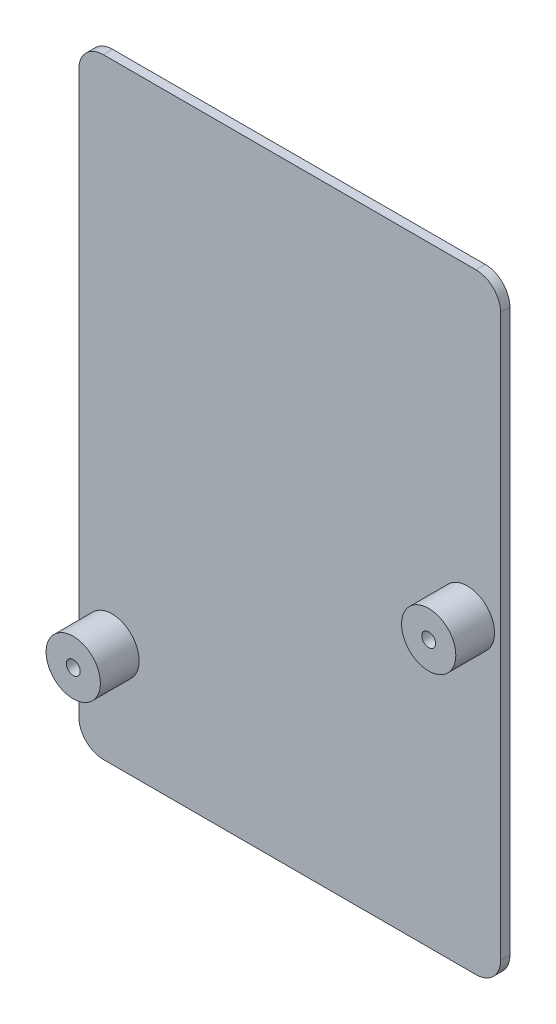
ISO-10303-21;
HEADER;
FILE_DESCRIPTION(('STEP AP214'),'2;1');
FILE_NAME('part.step','',(''),(''),'','','');
FILE_SCHEMA(('AUTOMOTIVE_DESIGN { 1 0 10303 214 1 1 1 1 }'));
ENDSEC;
DATA;
#1=APPLICATION_CONTEXT('core data for automotive mechanical design processes');
#2=APPLICATION_PROTOCOL_DEFINITION('international standard','automotive_design',2000,#1);
#3=PRODUCT_CONTEXT('',#1,'mechanical');
#4=PRODUCT('Part','Part','',(#3));
#5=PRODUCT_RELATED_PRODUCT_CATEGORY('part','',(#4));
#6=PRODUCT_DEFINITION_FORMATION('','',#4);
#7=PRODUCT_DEFINITION_CONTEXT('part definition',#1,'design');
#8=PRODUCT_DEFINITION('design','',#6,#7);
#9=PRODUCT_DEFINITION_SHAPE('','',#8);
#10=(LENGTH_UNIT() NAMED_UNIT(*) SI_UNIT(.MILLI.,.METRE.));
#11=(NAMED_UNIT(*) PLANE_ANGLE_UNIT() SI_UNIT($,.RADIAN.));
#12=(NAMED_UNIT(*) SI_UNIT($,.STERADIAN.) SOLID_ANGLE_UNIT());
#13=UNCERTAINTY_MEASURE_WITH_UNIT(LENGTH_MEASURE(1.E-05),#10,'distance_accuracy_value','');
#14=(GEOMETRIC_REPRESENTATION_CONTEXT(3) GLOBAL_UNCERTAINTY_ASSIGNED_CONTEXT((#13)) GLOBAL_UNIT_ASSIGNED_CONTEXT((#10,
#11,#12)) REPRESENTATION_CONTEXT('',''));
#15=CARTESIAN_POINT('',(0.,0.,0.));
#16=DIRECTION('',(0.,0.,1.));
#17=DIRECTION('',(1.,0.,0.));
#18=AXIS2_PLACEMENT_3D('',#15,#16,#17);
#19=CARTESIAN_POINT('',(0.,0.,1.2));
#20=DIRECTION('',(0.,0.,-1.));
#21=DIRECTION('',(-1.,0.,0.));
#22=AXIS2_PLACEMENT_3D('',#19,#20,#21);
#23=PLANE('',#22);
#24=CARTESIAN_POINT('',(-22.925,-26.04,1.2));
#25=DIRECTION('',(0.,0.,-1.));
#26=DIRECTION('',(-1.,0.,0.));
#27=AXIS2_PLACEMENT_3D('',#24,#25,#26);
#28=CIRCLE('',#27,3.5);
#29=CARTESIAN_POINT('',(-26.425,-26.04,1.2));
#30=VERTEX_POINT('',#29);
#31=EDGE_CURVE('E44',#30,#30,#28,.F.);
#32=ORIENTED_EDGE('',*,*,#31,.F.);
#33=EDGE_LOOP('',(#32));
#34=FACE_BOUND('',#33,.T.);
#35=DIRECTION('',(-1.,0.,0.));
#36=VECTOR('',#35,1.);
#37=CARTESIAN_POINT('',(-27.2034,39.37,1.2));
#38=LINE('',#37,#36);
#39=CARTESIAN_POINT('',(24.0284,39.37,1.2));
#40=VERTEX_POINT('',#39);
#41=CARTESIAN_POINT('',(-24.0284,39.37,1.2));
#42=VERTEX_POINT('',#41);
#43=EDGE_CURVE('E172',#40,#42,#38,.T.);
#44=ORIENTED_EDGE('',*,*,#43,.T.);
#45=CARTESIAN_POINT('',(-24.0284,36.195,1.2));
#46=DIRECTION('',(0.,0.,-1.));
#47=DIRECTION('',(-1.,0.,0.));
#48=AXIS2_PLACEMENT_3D('',#45,#46,#47);
#49=CIRCLE('',#48,3.175);
#50=CARTESIAN_POINT('',(-27.2034,36.195,1.2));
#51=VERTEX_POINT('',#50);
#52=EDGE_CURVE('E151',#42,#51,#49,.F.);
#53=ORIENTED_EDGE('',*,*,#52,.T.);
#54=DIRECTION('',(0.,-1.,0.));
#55=VECTOR('',#54,1.);
#56=CARTESIAN_POINT('',(-27.2034,-39.37,1.2));
#57=LINE('',#56,#55);
#58=CARTESIAN_POINT('',(-27.2034,-36.195,1.2));
#59=VERTEX_POINT('',#58);
#60=EDGE_CURVE('E122',#51,#59,#57,.T.);
#61=ORIENTED_EDGE('',*,*,#60,.T.);
#62=CARTESIAN_POINT('',(-24.0284,-36.195,1.2));
#63=DIRECTION('',(0.,0.,-1.));
#64=DIRECTION('',(-1.,0.,0.));
#65=AXIS2_PLACEMENT_3D('',#62,#63,#64);
#66=CIRCLE('',#65,3.175);
#67=CARTESIAN_POINT('',(-24.0284,-39.37,1.2));
#68=VERTEX_POINT('',#67);
#69=EDGE_CURVE('E58',#59,#68,#66,.F.);
#70=ORIENTED_EDGE('',*,*,#69,.T.);
#71=DIRECTION('',(1.,0.,0.));
#72=VECTOR('',#71,1.);
#73=CARTESIAN_POINT('',(-27.2034,-39.37,1.2));
#74=LINE('',#73,#72);
#75=CARTESIAN_POINT('',(24.0284,-39.37,1.2));
#76=VERTEX_POINT('',#75);
#77=EDGE_CURVE('E137',#68,#76,#74,.T.);
#78=ORIENTED_EDGE('',*,*,#77,.T.);
#79=CARTESIAN_POINT('',(24.0284,-36.195,1.2));
#80=DIRECTION('',(0.,0.,-1.));
#81=DIRECTION('',(-1.,0.,0.));
#82=AXIS2_PLACEMENT_3D('',#79,#80,#81);
#83=CIRCLE('',#82,3.175);
#84=CARTESIAN_POINT('',(27.2034,-36.195,1.2));
#85=VERTEX_POINT('',#84);
#86=EDGE_CURVE('E148',#76,#85,#83,.F.);
#87=ORIENTED_EDGE('',*,*,#86,.T.);
#88=DIRECTION('',(0.,1.,0.));
#89=VECTOR('',#88,1.);
#90=CARTESIAN_POINT('',(27.2034,-39.37,1.2));
#91=LINE('',#90,#89);
#92=CARTESIAN_POINT('',(27.2034,36.195,1.2));
#93=VERTEX_POINT('',#92);
#94=EDGE_CURVE('E131',#85,#93,#91,.T.);
#95=ORIENTED_EDGE('',*,*,#94,.T.);
#96=CARTESIAN_POINT('',(24.0284,36.195,1.2));
#97=DIRECTION('',(0.,0.,-1.));
#98=DIRECTION('',(-1.,0.,0.));
#99=AXIS2_PLACEMENT_3D('',#96,#97,#98);
#100=CIRCLE('',#99,3.175);
#101=EDGE_CURVE('E146',#93,#40,#100,.F.);
#102=ORIENTED_EDGE('',*,*,#101,.T.);
#103=EDGE_LOOP('',(#44,#53,#61,#70,#78,#87,#95,#102));
#104=FACE_BOUND('',#103,.T.);
#105=CARTESIAN_POINT('',(22.925,0.,1.2));
#106=DIRECTION('',(0.,0.,-1.));
#107=DIRECTION('',(-1.,0.,0.));
#108=AXIS2_PLACEMENT_3D('',#105,#106,#107);
#109=CIRCLE('',#108,3.5);
#110=CARTESIAN_POINT('',(19.425,0.,1.2));
#111=VERTEX_POINT('',#110);
#112=EDGE_CURVE('E11',#111,#111,#109,.F.);
#113=ORIENTED_EDGE('',*,*,#112,.F.);
#114=EDGE_LOOP('',(#113));
#115=FACE_BOUND('',#114,.T.);
#116=ADVANCED_FACE('F36',(#34,#104,#115),#23,.F.);
#117=CARTESIAN_POINT('',(27.2034,-39.37,1.2));
#118=DIRECTION('',(-1.,0.,0.));
#119=DIRECTION('',(0.,0.,1.));
#120=AXIS2_PLACEMENT_3D('',#117,#118,#119);
#121=PLANE('',#120);
#122=ORIENTED_EDGE('',*,*,#94,.F.);
#123=DIRECTION('',(0.,0.,-1.));
#124=VECTOR('',#123,1.);
#125=CARTESIAN_POINT('',(27.2034,-36.195,1.2));
#126=LINE('',#125,#124);
#127=CARTESIAN_POINT('',(27.2034,-36.195,0.));
#128=VERTEX_POINT('',#127);
#129=EDGE_CURVE('E159',#85,#128,#126,.T.);
#130=ORIENTED_EDGE('',*,*,#129,.T.);
#131=DIRECTION('',(0.,1.,0.));
#132=VECTOR('',#131,1.);
#133=CARTESIAN_POINT('',(27.2034,-39.37,0.));
#134=LINE('',#133,#132);
#135=CARTESIAN_POINT('',(27.2034,36.195,0.));
#136=VERTEX_POINT('',#135);
#137=EDGE_CURVE('E133',#128,#136,#134,.T.);
#138=ORIENTED_EDGE('',*,*,#137,.T.);
#139=DIRECTION('',(0.,0.,-1.));
#140=VECTOR('',#139,1.);
#141=CARTESIAN_POINT('',(27.2034,36.195,1.2));
#142=LINE('',#141,#140);
#143=EDGE_CURVE('E157',#136,#93,#142,.F.);
#144=ORIENTED_EDGE('',*,*,#143,.T.);
#145=EDGE_LOOP('',(#122,#130,#138,#144));
#146=FACE_BOUND('',#145,.T.);
#147=ADVANCED_FACE('F167',(#146),#121,.F.);
#148=CARTESIAN_POINT('',(-27.2034,39.37,1.2));
#149=DIRECTION('',(0.,-1.,0.));
#150=DIRECTION('',(0.,0.,-1.));
#151=AXIS2_PLACEMENT_3D('',#148,#149,#150);
#152=PLANE('',#151);
#153=DIRECTION('',(-1.,0.,0.));
#154=VECTOR('',#153,1.);
#155=CARTESIAN_POINT('',(-27.2034,39.37,0.));
#156=LINE('',#155,#154);
#157=CARTESIAN_POINT('',(24.0284,39.37,0.));
#158=VERTEX_POINT('',#157);
#159=CARTESIAN_POINT('',(-24.0284,39.37,0.));
#160=VERTEX_POINT('',#159);
#161=EDGE_CURVE('E129',#158,#160,#156,.T.);
#162=ORIENTED_EDGE('',*,*,#161,.T.);
#163=DIRECTION('',(0.,0.,-1.));
#164=VECTOR('',#163,1.);
#165=CARTESIAN_POINT('',(-24.0284,39.37,1.2));
#166=LINE('',#165,#164);
#167=EDGE_CURVE('E108',#160,#42,#166,.F.);
#168=ORIENTED_EDGE('',*,*,#167,.T.);
#169=ORIENTED_EDGE('',*,*,#43,.F.);
#170=DIRECTION('',(0.,0.,-1.));
#171=VECTOR('',#170,1.);
#172=CARTESIAN_POINT('',(24.0284,39.37,1.2));
#173=LINE('',#172,#171);
#174=EDGE_CURVE('E113',#40,#158,#173,.T.);
#175=ORIENTED_EDGE('',*,*,#174,.T.);
#176=EDGE_LOOP('',(#162,#168,#169,#175));
#177=FACE_BOUND('',#176,.T.);
#178=ADVANCED_FACE('F210',(#177),#152,.F.);
#179=CARTESIAN_POINT('',(-27.2034,-39.37,1.2));
#180=DIRECTION('',(1.,0.,0.));
#181=DIRECTION('',(0.,0.,-1.));
#182=AXIS2_PLACEMENT_3D('',#179,#180,#181);
#183=PLANE('',#182);
#184=ORIENTED_EDGE('',*,*,#60,.F.);
#185=DIRECTION('',(0.,0.,-1.));
#186=VECTOR('',#185,1.);
#187=CARTESIAN_POINT('',(-27.2034,36.195,1.2));
#188=LINE('',#187,#186);
#189=CARTESIAN_POINT('',(-27.2034,36.195,0.));
#190=VERTEX_POINT('',#189);
#191=EDGE_CURVE('E107',#51,#190,#188,.T.);
#192=ORIENTED_EDGE('',*,*,#191,.T.);
#193=DIRECTION('',(0.,-1.,0.));
#194=VECTOR('',#193,1.);
#195=CARTESIAN_POINT('',(-27.2034,-39.37,0.));
#196=LINE('',#195,#194);
#197=CARTESIAN_POINT('',(-27.2034,-36.195,0.));
#198=VERTEX_POINT('',#197);
#199=EDGE_CURVE('E120',#190,#198,#196,.T.);
#200=ORIENTED_EDGE('',*,*,#199,.T.);
#201=DIRECTION('',(0.,0.,-1.));
#202=VECTOR('',#201,1.);
#203=CARTESIAN_POINT('',(-27.2034,-36.195,1.2));
#204=LINE('',#203,#202);
#205=EDGE_CURVE('E124',#198,#59,#204,.F.);
#206=ORIENTED_EDGE('',*,*,#205,.T.);
#207=EDGE_LOOP('',(#184,#192,#200,#206));
#208=FACE_BOUND('',#207,.T.);
#209=ADVANCED_FACE('F119',(#208),#183,.F.);
#210=CARTESIAN_POINT('',(-27.2034,-39.37,1.2));
#211=DIRECTION('',(0.,1.,0.));
#212=DIRECTION('',(0.,0.,1.));
#213=AXIS2_PLACEMENT_3D('',#210,#211,#212);
#214=PLANE('',#213);
#215=ORIENTED_EDGE('',*,*,#77,.F.);
#216=DIRECTION('',(0.,0.,-1.));
#217=VECTOR('',#216,1.);
#218=CARTESIAN_POINT('',(-24.0284,-39.37,1.2));
#219=LINE('',#218,#217);
#220=CARTESIAN_POINT('',(-24.0284,-39.37,0.));
#221=VERTEX_POINT('',#220);
#222=EDGE_CURVE('E154',#68,#221,#219,.T.);
#223=ORIENTED_EDGE('',*,*,#222,.T.);
#224=DIRECTION('',(1.,0.,0.));
#225=VECTOR('',#224,1.);
#226=CARTESIAN_POINT('',(-27.2034,-39.37,0.));
#227=LINE('',#226,#225);
#228=CARTESIAN_POINT('',(24.0284,-39.37,0.));
#229=VERTEX_POINT('',#228);
#230=EDGE_CURVE('E128',#221,#229,#227,.T.);
#231=ORIENTED_EDGE('',*,*,#230,.T.);
#232=DIRECTION('',(0.,0.,-1.));
#233=VECTOR('',#232,1.);
#234=CARTESIAN_POINT('',(24.0284,-39.37,1.2));
#235=LINE('',#234,#233);
#236=EDGE_CURVE('E51',#229,#76,#235,.F.);
#237=ORIENTED_EDGE('',*,*,#236,.T.);
#238=EDGE_LOOP('',(#215,#223,#231,#237));
#239=FACE_BOUND('',#238,.T.);
#240=ADVANCED_FACE('F204',(#239),#214,.F.);
#241=CARTESIAN_POINT('',(0.,0.,0.));
#242=DIRECTION('',(0.,0.,-1.));
#243=DIRECTION('',(-1.,0.,0.));
#244=AXIS2_PLACEMENT_3D('',#241,#242,#243);
#245=PLANE('',#244);
#246=CARTESIAN_POINT('',(-22.925,-26.04,0.));
#247=DIRECTION('',(0.,0.,-1.));
#248=DIRECTION('',(-1.,0.,0.));
#249=AXIS2_PLACEMENT_3D('',#246,#247,#248);
#250=CIRCLE('',#249,0.89);
#251=CARTESIAN_POINT('',(-23.815,-26.04,0.));
#252=VERTEX_POINT('',#251);
#253=EDGE_CURVE('E244',#252,#252,#250,.F.);
#254=ORIENTED_EDGE('',*,*,#253,.T.);
#255=EDGE_LOOP('',(#254));
#256=FACE_BOUND('',#255,.T.);
#257=CARTESIAN_POINT('',(22.925,0.,0.));
#258=DIRECTION('',(0.,0.,-1.));
#259=DIRECTION('',(-1.,0.,0.));
#260=AXIS2_PLACEMENT_3D('',#257,#258,#259);
#261=CIRCLE('',#260,0.89);
#262=CARTESIAN_POINT('',(22.035,0.,0.));
#263=VERTEX_POINT('',#262);
#264=EDGE_CURVE('E240',#263,#263,#261,.F.);
#265=ORIENTED_EDGE('',*,*,#264,.T.);
#266=EDGE_LOOP('',(#265));
#267=FACE_BOUND('',#266,.T.);
#268=ORIENTED_EDGE('',*,*,#199,.F.);
#269=CARTESIAN_POINT('',(-24.0284,36.195,0.));
#270=DIRECTION('',(0.,0.,-1.));
#271=DIRECTION('',(-1.,0.,0.));
#272=AXIS2_PLACEMENT_3D('',#269,#270,#271);
#273=CIRCLE('',#272,3.175);
#274=EDGE_CURVE('E103',#190,#160,#273,.T.);
#275=ORIENTED_EDGE('',*,*,#274,.T.);
#276=ORIENTED_EDGE('',*,*,#161,.F.);
#277=CARTESIAN_POINT('',(24.0284,36.195,0.));
#278=DIRECTION('',(0.,0.,-1.));
#279=DIRECTION('',(-1.,0.,0.));
#280=AXIS2_PLACEMENT_3D('',#277,#278,#279);
#281=CIRCLE('',#280,3.175);
#282=EDGE_CURVE('E123',#158,#136,#281,.T.);
#283=ORIENTED_EDGE('',*,*,#282,.T.);
#284=ORIENTED_EDGE('',*,*,#137,.F.);
#285=CARTESIAN_POINT('',(24.0284,-36.195,0.));
#286=DIRECTION('',(0.,0.,-1.));
#287=DIRECTION('',(-1.,0.,0.));
#288=AXIS2_PLACEMENT_3D('',#285,#286,#287);
#289=CIRCLE('',#288,3.175);
#290=EDGE_CURVE('E140',#128,#229,#289,.T.);
#291=ORIENTED_EDGE('',*,*,#290,.T.);
#292=ORIENTED_EDGE('',*,*,#230,.F.);
#293=CARTESIAN_POINT('',(-24.0284,-36.195,0.));
#294=DIRECTION('',(0.,0.,-1.));
#295=DIRECTION('',(-1.,0.,0.));
#296=AXIS2_PLACEMENT_3D('',#293,#294,#295);
#297=CIRCLE('',#296,3.175);
#298=EDGE_CURVE('E114',#221,#198,#297,.T.);
#299=ORIENTED_EDGE('',*,*,#298,.T.);
#300=EDGE_LOOP('',(#268,#275,#276,#283,#284,#291,#292,#299));
#301=FACE_BOUND('',#300,.T.);
#302=ADVANCED_FACE('F126',(#256,#267,#301),#245,.T.);
#303=CARTESIAN_POINT('',(-24.0284,36.195,1.2));
#304=DIRECTION('',(0.,0.,-1.));
#305=DIRECTION('',(-1.,0.,0.));
#306=AXIS2_PLACEMENT_3D('',#303,#304,#305);
#307=CYLINDRICAL_SURFACE('',#306,3.175);
#308=ORIENTED_EDGE('',*,*,#52,.F.);
#309=ORIENTED_EDGE('',*,*,#167,.F.);
#310=ORIENTED_EDGE('',*,*,#274,.F.);
#311=ORIENTED_EDGE('',*,*,#191,.F.);
#312=EDGE_LOOP('',(#308,#309,#310,#311));
#313=FACE_BOUND('',#312,.T.);
#314=ADVANCED_FACE('F106',(#313),#307,.T.);
#315=CARTESIAN_POINT('',(-24.0284,-36.195,1.2));
#316=DIRECTION('',(0.,0.,-1.));
#317=DIRECTION('',(-1.,0.,0.));
#318=AXIS2_PLACEMENT_3D('',#315,#316,#317);
#319=CYLINDRICAL_SURFACE('',#318,3.175);
#320=ORIENTED_EDGE('',*,*,#69,.F.);
#321=ORIENTED_EDGE('',*,*,#205,.F.);
#322=ORIENTED_EDGE('',*,*,#298,.F.);
#323=ORIENTED_EDGE('',*,*,#222,.F.);
#324=EDGE_LOOP('',(#320,#321,#322,#323));
#325=FACE_BOUND('',#324,.T.);
#326=ADVANCED_FACE('F219',(#325),#319,.T.);
#327=CARTESIAN_POINT('',(24.0284,-36.195,1.2));
#328=DIRECTION('',(0.,0.,-1.));
#329=DIRECTION('',(-1.,0.,0.));
#330=AXIS2_PLACEMENT_3D('',#327,#328,#329);
#331=CYLINDRICAL_SURFACE('',#330,3.175);
#332=ORIENTED_EDGE('',*,*,#86,.F.);
#333=ORIENTED_EDGE('',*,*,#236,.F.);
#334=ORIENTED_EDGE('',*,*,#290,.F.);
#335=ORIENTED_EDGE('',*,*,#129,.F.);
#336=EDGE_LOOP('',(#332,#333,#334,#335));
#337=FACE_BOUND('',#336,.T.);
#338=ADVANCED_FACE('F221',(#337),#331,.T.);
#339=CARTESIAN_POINT('',(24.0284,36.195,1.2));
#340=DIRECTION('',(0.,0.,-1.));
#341=DIRECTION('',(-1.,0.,0.));
#342=AXIS2_PLACEMENT_3D('',#339,#340,#341);
#343=CYLINDRICAL_SURFACE('',#342,3.175);
#344=ORIENTED_EDGE('',*,*,#101,.F.);
#345=ORIENTED_EDGE('',*,*,#143,.F.);
#346=ORIENTED_EDGE('',*,*,#282,.F.);
#347=ORIENTED_EDGE('',*,*,#174,.F.);
#348=EDGE_LOOP('',(#344,#345,#346,#347));
#349=FACE_BOUND('',#348,.T.);
#350=ADVANCED_FACE('F38',(#349),#343,.T.);
#351=CARTESIAN_POINT('',(22.925,0.,1.200012));
#352=DIRECTION('',(0.,0.,-1.));
#353=DIRECTION('',(-1.,0.,0.));
#354=AXIS2_PLACEMENT_3D('',#351,#352,#353);
#355=CYLINDRICAL_SURFACE('',#354,0.89);
#356=CARTESIAN_POINT('',(22.925,0.,6.2));
#357=DIRECTION('',(0.,0.,1.));
#358=DIRECTION('',(1.,0.,0.));
#359=AXIS2_PLACEMENT_3D('',#356,#357,#358);
#360=CIRCLE('',#359,0.89);
#361=CARTESIAN_POINT('',(22.035,0.,6.2));
#362=VERTEX_POINT('',#361);
#363=EDGE_CURVE('E258',#362,#362,#360,.T.);
#364=CARTESIAN_POINT('',(22.035,0.,0.));
#365=CARTESIAN_POINT('',(22.035,0.,0.0645833333333335));
#366=CARTESIAN_POINT('',(22.035,0.,0.129166666666667));
#367=CARTESIAN_POINT('',(22.035,0.,0.258333333333334));
#368=CARTESIAN_POINT('',(22.035,0.,0.322916666666667));
#369=CARTESIAN_POINT('',(22.035,0.,0.452083333333333));
#370=CARTESIAN_POINT('',(22.035,0.,0.516666666666667));
#371=CARTESIAN_POINT('',(22.035,0.,0.645833333333333));
#372=CARTESIAN_POINT('',(22.035,0.,0.710416666666667));
#373=CARTESIAN_POINT('',(22.035,0.,0.839583333333333));
#374=CARTESIAN_POINT('',(22.035,0.,0.904166666666667));
#375=CARTESIAN_POINT('',(22.035,0.,1.03333333333333));
#376=CARTESIAN_POINT('',(22.035,0.,1.09791666666667));
#377=CARTESIAN_POINT('',(22.035,0.,1.22708333333333));
#378=CARTESIAN_POINT('',(22.035,0.,1.29166666666667));
#379=CARTESIAN_POINT('',(22.035,0.,1.42083333333333));
#380=CARTESIAN_POINT('',(22.035,0.,1.48541666666667));
#381=CARTESIAN_POINT('',(22.035,0.,1.61458333333333));
#382=CARTESIAN_POINT('',(22.035,0.,1.67916666666667));
#383=CARTESIAN_POINT('',(22.035,0.,1.80833333333333));
#384=CARTESIAN_POINT('',(22.035,0.,1.87291666666667));
#385=CARTESIAN_POINT('',(22.035,0.,2.00208333333333));
#386=CARTESIAN_POINT('',(22.035,0.,2.06666666666667));
#387=CARTESIAN_POINT('',(22.035,0.,2.19583333333333));
#388=CARTESIAN_POINT('',(22.035,0.,2.26041666666667));
#389=CARTESIAN_POINT('',(22.035,0.,2.38958333333333));
#390=CARTESIAN_POINT('',(22.035,0.,2.45416666666667));
#391=CARTESIAN_POINT('',(22.035,0.,2.58333333333333));
#392=CARTESIAN_POINT('',(22.035,0.,2.64791666666667));
#393=CARTESIAN_POINT('',(22.035,0.,2.77708333333333));
#394=CARTESIAN_POINT('',(22.035,0.,2.84166666666667));
#395=CARTESIAN_POINT('',(22.035,0.,2.97083333333333));
#396=CARTESIAN_POINT('',(22.035,0.,3.03541666666667));
#397=CARTESIAN_POINT('',(22.035,0.,3.16458333333333));
#398=CARTESIAN_POINT('',(22.035,0.,3.22916666666667));
#399=CARTESIAN_POINT('',(22.035,0.,3.35833333333333));
#400=CARTESIAN_POINT('',(22.035,0.,3.42291666666667));
#401=CARTESIAN_POINT('',(22.035,0.,3.55208333333333));
#402=CARTESIAN_POINT('',(22.035,0.,3.61666666666667));
#403=CARTESIAN_POINT('',(22.035,0.,3.74583333333333));
#404=CARTESIAN_POINT('',(22.035,0.,3.81041666666667));
#405=CARTESIAN_POINT('',(22.035,0.,3.93958333333333));
#406=CARTESIAN_POINT('',(22.035,0.,4.00416666666667));
#407=CARTESIAN_POINT('',(22.035,0.,4.13333333333333));
#408=CARTESIAN_POINT('',(22.035,0.,4.19791666666667));
#409=CARTESIAN_POINT('',(22.035,0.,4.32708333333333));
#410=CARTESIAN_POINT('',(22.035,0.,4.39166666666667));
#411=CARTESIAN_POINT('',(22.035,0.,4.52083333333333));
#412=CARTESIAN_POINT('',(22.035,0.,4.58541666666667));
#413=CARTESIAN_POINT('',(22.035,0.,4.71458333333333));
#414=CARTESIAN_POINT('',(22.035,0.,4.77916666666667));
#415=CARTESIAN_POINT('',(22.035,0.,4.90833333333333));
#416=CARTESIAN_POINT('',(22.035,0.,4.97291666666667));
#417=CARTESIAN_POINT('',(22.035,0.,5.10208333333333));
#418=CARTESIAN_POINT('',(22.035,0.,5.16666666666667));
#419=CARTESIAN_POINT('',(22.035,0.,5.29583333333333));
#420=CARTESIAN_POINT('',(22.035,0.,5.36041666666667));
#421=CARTESIAN_POINT('',(22.035,0.,5.48958333333333));
#422=CARTESIAN_POINT('',(22.035,0.,5.55416666666667));
#423=CARTESIAN_POINT('',(22.035,0.,5.68333333333333));
#424=CARTESIAN_POINT('',(22.035,0.,5.74791666666667));
#425=CARTESIAN_POINT('',(22.035,0.,5.87708333333333));
#426=CARTESIAN_POINT('',(22.035,0.,5.94166666666667));
#427=CARTESIAN_POINT('',(22.035,0.,6.07083333333333));
#428=CARTESIAN_POINT('',(22.035,0.,6.13541666666667));
#429=CARTESIAN_POINT('',(22.035,0.,6.2));
#430=B_SPLINE_CURVE_WITH_KNOTS('',3,(#364,#365,#366,#367,#368,#369,#370,#371,#372,#373,#374,
#375,#376,#377,#378,#379,#380,#381,#382,#383,#384,#385,#386,#387,#388,#389,#390,#391,#392,#393,
#394,#395,#396,#397,#398,#399,#400,#401,#402,#403,#404,#405,#406,#407,#408,#409,#410,#411,#412,
#413,#414,#415,#416,#417,#418,#419,#420,#421,#422,#423,#424,#425,#426,#427,#428,#429),
.UNSPECIFIED.,.F.,.F.,(4,2,2,2,2,2,2,2,2,2,2,2,2,2,2,2,2,2,2,2,2,2,2,2,2,2,2,2,2,2,2,2,4),(0.,
0.19375,0.3875,0.58125,0.775,0.96875,1.1625,1.35625,1.55,1.74375,1.9375,2.13125,2.325,2.51875,
2.7125,2.90625,3.1,3.29375,3.4875,3.68125,3.875,4.06875,4.2625,4.45625,4.65,4.84375,5.0375,
5.23125,5.425,5.61875,5.8125,6.00625,6.2),.UNSPECIFIED.);
#431=EDGE_CURVE('BSEAM197',#263,#362,#430,.T.);
#432=ORIENTED_EDGE('',*,*,#264,.F.);
#433=ORIENTED_EDGE('',*,*,#363,.T.);
#434=ORIENTED_EDGE('',*,*,#431,.T.);
#435=ORIENTED_EDGE('',*,*,#431,.F.);
#436=EDGE_LOOP('',(#432,#434,#433,#435));
#437=FACE_BOUND('',#436,.T.);
#438=ADVANCED_FACE('F197',(#437),#355,.F.);
#439=CARTESIAN_POINT('',(-22.925,-26.04,1.200012));
#440=DIRECTION('',(0.,0.,-1.));
#441=DIRECTION('',(-1.,0.,0.));
#442=AXIS2_PLACEMENT_3D('',#439,#440,#441);
#443=CYLINDRICAL_SURFACE('',#442,0.89);
#444=CARTESIAN_POINT('',(-22.925,-26.04,6.2));
#445=DIRECTION('',(0.,0.,1.));
#446=DIRECTION('',(1.,0.,0.));
#447=AXIS2_PLACEMENT_3D('',#444,#445,#446);
#448=CIRCLE('',#447,0.89);
#449=CARTESIAN_POINT('',(-23.815,-26.04,6.2));
#450=VERTEX_POINT('',#449);
#451=EDGE_CURVE('E252',#450,#450,#448,.T.);
#452=CARTESIAN_POINT('',(-23.815,-26.04,0.));
#453=CARTESIAN_POINT('',(-23.815,-26.04,0.0645833333333335));
#454=CARTESIAN_POINT('',(-23.815,-26.04,0.129166666666667));
#455=CARTESIAN_POINT('',(-23.815,-26.04,0.258333333333334));
#456=CARTESIAN_POINT('',(-23.815,-26.04,0.322916666666667));
#457=CARTESIAN_POINT('',(-23.815,-26.04,0.452083333333333));
#458=CARTESIAN_POINT('',(-23.815,-26.04,0.516666666666667));
#459=CARTESIAN_POINT('',(-23.815,-26.04,0.645833333333333));
#460=CARTESIAN_POINT('',(-23.815,-26.04,0.710416666666667));
#461=CARTESIAN_POINT('',(-23.815,-26.04,0.839583333333333));
#462=CARTESIAN_POINT('',(-23.815,-26.04,0.904166666666667));
#463=CARTESIAN_POINT('',(-23.815,-26.04,1.03333333333333));
#464=CARTESIAN_POINT('',(-23.815,-26.04,1.09791666666667));
#465=CARTESIAN_POINT('',(-23.815,-26.04,1.22708333333333));
#466=CARTESIAN_POINT('',(-23.815,-26.04,1.29166666666667));
#467=CARTESIAN_POINT('',(-23.815,-26.04,1.42083333333333));
#468=CARTESIAN_POINT('',(-23.815,-26.04,1.48541666666667));
#469=CARTESIAN_POINT('',(-23.815,-26.04,1.61458333333333));
#470=CARTESIAN_POINT('',(-23.815,-26.04,1.67916666666667));
#471=CARTESIAN_POINT('',(-23.815,-26.04,1.80833333333333));
#472=CARTESIAN_POINT('',(-23.815,-26.04,1.87291666666667));
#473=CARTESIAN_POINT('',(-23.815,-26.04,2.00208333333333));
#474=CARTESIAN_POINT('',(-23.815,-26.04,2.06666666666667));
#475=CARTESIAN_POINT('',(-23.815,-26.04,2.19583333333333));
#476=CARTESIAN_POINT('',(-23.815,-26.04,2.26041666666667));
#477=CARTESIAN_POINT('',(-23.815,-26.04,2.38958333333333));
#478=CARTESIAN_POINT('',(-23.815,-26.04,2.45416666666667));
#479=CARTESIAN_POINT('',(-23.815,-26.04,2.58333333333333));
#480=CARTESIAN_POINT('',(-23.815,-26.04,2.64791666666667));
#481=CARTESIAN_POINT('',(-23.815,-26.04,2.77708333333333));
#482=CARTESIAN_POINT('',(-23.815,-26.04,2.84166666666667));
#483=CARTESIAN_POINT('',(-23.815,-26.04,2.97083333333333));
#484=CARTESIAN_POINT('',(-23.815,-26.04,3.03541666666667));
#485=CARTESIAN_POINT('',(-23.815,-26.04,3.16458333333333));
#486=CARTESIAN_POINT('',(-23.815,-26.04,3.22916666666667));
#487=CARTESIAN_POINT('',(-23.815,-26.04,3.35833333333333));
#488=CARTESIAN_POINT('',(-23.815,-26.04,3.42291666666667));
#489=CARTESIAN_POINT('',(-23.815,-26.04,3.55208333333333));
#490=CARTESIAN_POINT('',(-23.815,-26.04,3.61666666666667));
#491=CARTESIAN_POINT('',(-23.815,-26.04,3.74583333333333));
#492=CARTESIAN_POINT('',(-23.815,-26.04,3.81041666666667));
#493=CARTESIAN_POINT('',(-23.815,-26.04,3.93958333333333));
#494=CARTESIAN_POINT('',(-23.815,-26.04,4.00416666666667));
#495=CARTESIAN_POINT('',(-23.815,-26.04,4.13333333333333));
#496=CARTESIAN_POINT('',(-23.815,-26.04,4.19791666666667));
#497=CARTESIAN_POINT('',(-23.815,-26.04,4.32708333333333));
#498=CARTESIAN_POINT('',(-23.815,-26.04,4.39166666666667));
#499=CARTESIAN_POINT('',(-23.815,-26.04,4.52083333333333));
#500=CARTESIAN_POINT('',(-23.815,-26.04,4.58541666666667));
#501=CARTESIAN_POINT('',(-23.815,-26.04,4.71458333333333));
#502=CARTESIAN_POINT('',(-23.815,-26.04,4.77916666666667));
#503=CARTESIAN_POINT('',(-23.815,-26.04,4.90833333333333));
#504=CARTESIAN_POINT('',(-23.815,-26.04,4.97291666666667));
#505=CARTESIAN_POINT('',(-23.815,-26.04,5.10208333333333));
#506=CARTESIAN_POINT('',(-23.815,-26.04,5.16666666666667));
#507=CARTESIAN_POINT('',(-23.815,-26.04,5.29583333333333));
#508=CARTESIAN_POINT('',(-23.815,-26.04,5.36041666666667));
#509=CARTESIAN_POINT('',(-23.815,-26.04,5.48958333333333));
#510=CARTESIAN_POINT('',(-23.815,-26.04,5.55416666666667));
#511=CARTESIAN_POINT('',(-23.815,-26.04,5.68333333333333));
#512=CARTESIAN_POINT('',(-23.815,-26.04,5.74791666666667));
#513=CARTESIAN_POINT('',(-23.815,-26.04,5.87708333333333));
#514=CARTESIAN_POINT('',(-23.815,-26.04,5.94166666666667));
#515=CARTESIAN_POINT('',(-23.815,-26.04,6.07083333333333));
#516=CARTESIAN_POINT('',(-23.815,-26.04,6.13541666666667));
#517=CARTESIAN_POINT('',(-23.815,-26.04,6.2));
#518=B_SPLINE_CURVE_WITH_KNOTS('',3,(#452,#453,#454,#455,#456,#457,#458,#459,#460,#461,#462,
#463,#464,#465,#466,#467,#468,#469,#470,#471,#472,#473,#474,#475,#476,#477,#478,#479,#480,#481,
#482,#483,#484,#485,#486,#487,#488,#489,#490,#491,#492,#493,#494,#495,#496,#497,#498,#499,#500,
#501,#502,#503,#504,#505,#506,#507,#508,#509,#510,#511,#512,#513,#514,#515,#516,#517),
.UNSPECIFIED.,.F.,.F.,(4,2,2,2,2,2,2,2,2,2,2,2,2,2,2,2,2,2,2,2,2,2,2,2,2,2,2,2,2,2,2,2,4),(0.,
0.19375,0.3875,0.58125,0.775,0.96875,1.1625,1.35625,1.55,1.74375,1.9375,2.13125,2.325,2.51875,
2.7125,2.90625,3.1,3.29375,3.4875,3.68125,3.875,4.06875,4.2625,4.45625,4.65,4.84375,5.0375,
5.23125,5.425,5.61875,5.8125,6.00625,6.2),.UNSPECIFIED.);
#519=EDGE_CURVE('BSEAM190',#252,#450,#518,.T.);
#520=ORIENTED_EDGE('',*,*,#253,.F.);
#521=ORIENTED_EDGE('',*,*,#451,.T.);
#522=ORIENTED_EDGE('',*,*,#519,.T.);
#523=ORIENTED_EDGE('',*,*,#519,.F.);
#524=EDGE_LOOP('',(#520,#522,#521,#523));
#525=FACE_BOUND('',#524,.T.);
#526=ADVANCED_FACE('F190',(#525),#443,.F.);
#527=CARTESIAN_POINT('',(-22.925,-26.04,6.2));
#528=DIRECTION('',(0.,0.,1.));
#529=DIRECTION('',(1.,0.,0.));
#530=AXIS2_PLACEMENT_3D('',#527,#528,#529);
#531=PLANE('',#530);
#532=CARTESIAN_POINT('',(-22.925,-26.04,6.2));
#533=DIRECTION('',(0.,0.,1.));
#534=DIRECTION('',(1.,0.,0.));
#535=AXIS2_PLACEMENT_3D('',#532,#533,#534);
#536=CIRCLE('',#535,3.5);
#537=CARTESIAN_POINT('',(-19.425,-26.04,6.2));
#538=VERTEX_POINT('',#537);
#539=EDGE_CURVE('E248',#538,#538,#536,.T.);
#540=ORIENTED_EDGE('',*,*,#539,.T.);
#541=EDGE_LOOP('',(#540));
#542=FACE_BOUND('',#541,.T.);
#543=ORIENTED_EDGE('',*,*,#451,.F.);
#544=EDGE_LOOP('',(#543));
#545=FACE_BOUND('',#544,.T.);
#546=ADVANCED_FACE('F187',(#542,#545),#531,.T.);
#547=CARTESIAN_POINT('',(-22.925,-26.04,6.2));
#548=DIRECTION('',(0.,0.,-1.));
#549=DIRECTION('',(-1.,0.,0.));
#550=AXIS2_PLACEMENT_3D('',#547,#548,#549);
#551=CYLINDRICAL_SURFACE('',#550,3.5);
#552=ORIENTED_EDGE('',*,*,#539,.F.);
#553=EDGE_LOOP('',(#552));
#554=FACE_BOUND('',#553,.T.);
#555=ORIENTED_EDGE('',*,*,#31,.T.);
#556=EDGE_LOOP('',(#555));
#557=FACE_BOUND('',#556,.T.);
#558=ADVANCED_FACE('F164',(#554,#557),#551,.T.);
#559=CARTESIAN_POINT('',(22.925,0.,6.2));
#560=DIRECTION('',(0.,0.,1.));
#561=DIRECTION('',(1.,0.,0.));
#562=AXIS2_PLACEMENT_3D('',#559,#560,#561);
#563=PLANE('',#562);
#564=CARTESIAN_POINT('',(22.925,0.,6.2));
#565=DIRECTION('',(0.,0.,1.));
#566=DIRECTION('',(1.,0.,0.));
#567=AXIS2_PLACEMENT_3D('',#564,#565,#566);
#568=CIRCLE('',#567,3.5);
#569=CARTESIAN_POINT('',(26.425,0.,6.2));
#570=VERTEX_POINT('',#569);
#571=EDGE_CURVE('E255',#570,#570,#568,.T.);
#572=ORIENTED_EDGE('',*,*,#571,.T.);
#573=EDGE_LOOP('',(#572));
#574=FACE_BOUND('',#573,.T.);
#575=ORIENTED_EDGE('',*,*,#363,.F.);
#576=EDGE_LOOP('',(#575));
#577=FACE_BOUND('',#576,.T.);
#578=ADVANCED_FACE('F177',(#574,#577),#563,.T.);
#579=CARTESIAN_POINT('',(22.925,0.,6.2));
#580=DIRECTION('',(0.,0.,-1.));
#581=DIRECTION('',(-1.,0.,0.));
#582=AXIS2_PLACEMENT_3D('',#579,#580,#581);
#583=CYLINDRICAL_SURFACE('',#582,3.5);
#584=ORIENTED_EDGE('',*,*,#571,.F.);
#585=EDGE_LOOP('',(#584));
#586=FACE_BOUND('',#585,.T.);
#587=ORIENTED_EDGE('',*,*,#112,.T.);
#588=EDGE_LOOP('',(#587));
#589=FACE_BOUND('',#588,.T.);
#590=ADVANCED_FACE('F175',(#586,#589),#583,.T.);
#591=CLOSED_SHELL('',(#116,#147,#178,#209,#240,#302,#314,#326,#338,#350,#438,#526,#546,#558,
#578,#590));
#592=MANIFOLD_SOLID_BREP('B2',#591);
#593=ADVANCED_BREP_SHAPE_REPRESENTATION('',(#18,#592),#14);
#594=SHAPE_DEFINITION_REPRESENTATION(#9,#593);
ENDSEC;
END-ISO-10303-21;
